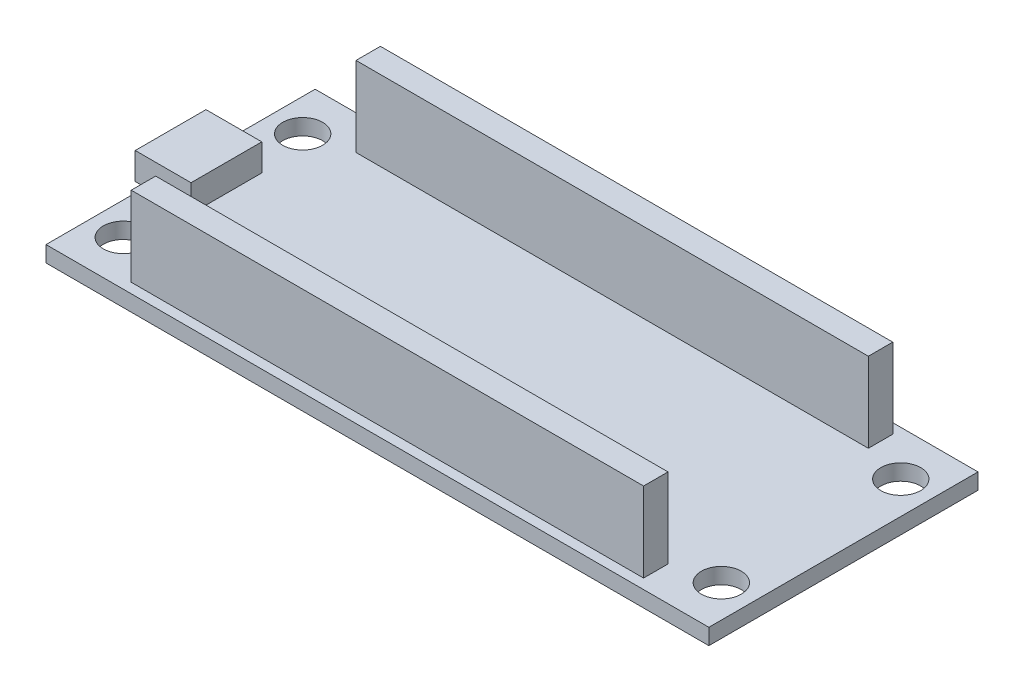
ISO-10303-21;
HEADER;
FILE_DESCRIPTION(('STEP AP214'),'2;1');
FILE_NAME('part.step','',(''),(''),'','','');
FILE_SCHEMA(('AUTOMOTIVE_DESIGN { 1 0 10303 214 1 1 1 1 }'));
ENDSEC;
DATA;
#1=APPLICATION_CONTEXT('core data for automotive mechanical design processes');
#2=APPLICATION_PROTOCOL_DEFINITION('international standard','automotive_design',2000,#1);
#3=PRODUCT_CONTEXT('',#1,'mechanical');
#4=PRODUCT('Part','Part','',(#3));
#5=PRODUCT_RELATED_PRODUCT_CATEGORY('part','',(#4));
#6=PRODUCT_DEFINITION_FORMATION('','',#4);
#7=PRODUCT_DEFINITION_CONTEXT('part definition',#1,'design');
#8=PRODUCT_DEFINITION('design','',#6,#7);
#9=PRODUCT_DEFINITION_SHAPE('','',#8);
#10=(LENGTH_UNIT() NAMED_UNIT(*) SI_UNIT(.MILLI.,.METRE.));
#11=(NAMED_UNIT(*) PLANE_ANGLE_UNIT() SI_UNIT($,.RADIAN.));
#12=(NAMED_UNIT(*) SI_UNIT($,.STERADIAN.) SOLID_ANGLE_UNIT());
#13=UNCERTAINTY_MEASURE_WITH_UNIT(LENGTH_MEASURE(1.E-05),#10,'distance_accuracy_value','');
#14=(GEOMETRIC_REPRESENTATION_CONTEXT(3) GLOBAL_UNCERTAINTY_ASSIGNED_CONTEXT((#13)) GLOBAL_UNIT_ASSIGNED_CONTEXT((#10,
#11,#12)) REPRESENTATION_CONTEXT('',''));
#15=CARTESIAN_POINT('',(0.,0.,0.));
#16=DIRECTION('',(0.,0.,1.));
#17=DIRECTION('',(1.,0.,0.));
#18=AXIS2_PLACEMENT_3D('',#15,#16,#17);
#19=CARTESIAN_POINT('',(0.,1.6,0.));
#20=DIRECTION('',(0.,1.,0.));
#21=DIRECTION('',(0.,0.,1.));
#22=AXIS2_PLACEMENT_3D('',#19,#20,#21);
#23=PLANE('',#22);
#24=DIRECTION('',(-1.,0.,0.));
#25=VECTOR('',#24,1.);
#26=CARTESIAN_POINT('',(-34.25,1.6,-3.55));
#27=LINE('',#26,#25);
#28=CARTESIAN_POINT('',(-28.65,1.6,-3.55));
#29=VERTEX_POINT('',#28);
#30=CARTESIAN_POINT('',(-33.25,1.6,-3.55));
#31=VERTEX_POINT('',#30);
#32=EDGE_CURVE('E226',#29,#31,#27,.T.);
#33=ORIENTED_EDGE('',*,*,#32,.F.);
#34=DIRECTION('',(0.,0.,-1.));
#35=VECTOR('',#34,1.);
#36=CARTESIAN_POINT('',(-28.65,1.6,-3.55));
#37=LINE('',#36,#35);
#38=CARTESIAN_POINT('',(-28.65,1.6,3.55));
#39=VERTEX_POINT('',#38);
#40=EDGE_CURVE('E236',#39,#29,#37,.T.);
#41=ORIENTED_EDGE('',*,*,#40,.F.);
#42=DIRECTION('',(1.,0.,0.));
#43=VECTOR('',#42,1.);
#44=CARTESIAN_POINT('',(-34.25,1.6,3.55));
#45=LINE('',#44,#43);
#46=CARTESIAN_POINT('',(-33.25,1.6,3.55));
#47=VERTEX_POINT('',#46);
#48=EDGE_CURVE('E11',#47,#39,#45,.T.);
#49=ORIENTED_EDGE('',*,*,#48,.F.);
#50=DIRECTION('',(0.,0.,1.));
#51=VECTOR('',#50,1.);
#52=CARTESIAN_POINT('',(-33.25,1.6,-13.5));
#53=LINE('',#52,#51);
#54=CARTESIAN_POINT('',(-33.25,1.6,13.5));
#55=VERTEX_POINT('',#54);
#56=EDGE_CURVE('E284',#47,#55,#53,.T.);
#57=ORIENTED_EDGE('',*,*,#56,.T.);
#58=DIRECTION('',(1.,0.,0.));
#59=VECTOR('',#58,1.);
#60=CARTESIAN_POINT('',(-33.25,1.6,13.5));
#61=LINE('',#60,#59);
#62=CARTESIAN_POINT('',(33.25,1.6,13.5));
#63=VERTEX_POINT('',#62);
#64=EDGE_CURVE('E288',#55,#63,#61,.T.);
#65=ORIENTED_EDGE('',*,*,#64,.T.);
#66=DIRECTION('',(0.,0.,-1.));
#67=VECTOR('',#66,1.);
#68=CARTESIAN_POINT('',(33.25,1.6,-13.5));
#69=LINE('',#68,#67);
#70=CARTESIAN_POINT('',(33.25,1.6,-13.5));
#71=VERTEX_POINT('',#70);
#72=EDGE_CURVE('E278',#63,#71,#69,.T.);
#73=ORIENTED_EDGE('',*,*,#72,.T.);
#74=DIRECTION('',(-1.,0.,0.));
#75=VECTOR('',#74,1.);
#76=CARTESIAN_POINT('',(-33.25,1.6,-13.5));
#77=LINE('',#76,#75);
#78=CARTESIAN_POINT('',(-33.25,1.6,-13.5));
#79=VERTEX_POINT('',#78);
#80=EDGE_CURVE('E281',#71,#79,#77,.T.);
#81=ORIENTED_EDGE('',*,*,#80,.T.);
#82=EDGE_CURVE('E285',#79,#31,#53,.T.);
#83=ORIENTED_EDGE('',*,*,#82,.T.);
#84=EDGE_LOOP('',(#33,#41,#49,#57,#65,#73,#81,#83));
#85=FACE_BOUND('',#84,.T.);
#86=CARTESIAN_POINT('',(30.,1.6,9.));
#87=DIRECTION('',(0.,1.,0.));
#88=DIRECTION('',(0.,0.,1.));
#89=AXIS2_PLACEMENT_3D('',#86,#87,#88);
#90=CIRCLE('',#89,2.);
#91=CARTESIAN_POINT('',(30.,1.6,11.));
#92=VERTEX_POINT('',#91);
#93=EDGE_CURVE('E260',#92,#92,#90,.T.);
#94=ORIENTED_EDGE('',*,*,#93,.F.);
#95=EDGE_LOOP('',(#94));
#96=FACE_BOUND('',#95,.T.);
#97=CARTESIAN_POINT('',(-30.,1.6,-9.));
#98=DIRECTION('',(0.,1.,0.));
#99=DIRECTION('',(0.,0.,1.));
#100=AXIS2_PLACEMENT_3D('',#97,#98,#99);
#101=CIRCLE('',#100,2.);
#102=CARTESIAN_POINT('',(-30.,1.6,-7.));
#103=VERTEX_POINT('',#102);
#104=EDGE_CURVE('E272',#103,#103,#101,.T.);
#105=ORIENTED_EDGE('',*,*,#104,.F.);
#106=EDGE_LOOP('',(#105));
#107=FACE_BOUND('',#106,.T.);
#108=CARTESIAN_POINT('',(-30.,1.6,9.));
#109=DIRECTION('',(0.,1.,0.));
#110=DIRECTION('',(0.,0.,1.));
#111=AXIS2_PLACEMENT_3D('',#108,#109,#110);
#112=CIRCLE('',#111,2.);
#113=CARTESIAN_POINT('',(-30.,1.6,11.));
#114=VERTEX_POINT('',#113);
#115=EDGE_CURVE('E266',#114,#114,#112,.T.);
#116=ORIENTED_EDGE('',*,*,#115,.F.);
#117=EDGE_LOOP('',(#116));
#118=FACE_BOUND('',#117,.T.);
#119=CARTESIAN_POINT('',(30.,1.6,-9.));
#120=DIRECTION('',(0.,1.,0.));
#121=DIRECTION('',(0.,0.,1.));
#122=AXIS2_PLACEMENT_3D('',#119,#120,#121);
#123=CIRCLE('',#122,2.);
#124=CARTESIAN_POINT('',(30.,1.6,-7.));
#125=VERTEX_POINT('',#124);
#126=EDGE_CURVE('E254',#125,#125,#123,.T.);
#127=ORIENTED_EDGE('',*,*,#126,.F.);
#128=EDGE_LOOP('',(#127));
#129=FACE_BOUND('',#128,.T.);
#130=DIRECTION('',(1.,0.,0.));
#131=VECTOR('',#130,1.);
#132=CARTESIAN_POINT('',(-25.7,1.6,-10.05));
#133=LINE('',#132,#131);
#134=CARTESIAN_POINT('',(-25.7,1.6,-10.05));
#135=VERTEX_POINT('',#134);
#136=CARTESIAN_POINT('',(25.7,1.6,-10.05));
#137=VERTEX_POINT('',#136);
#138=EDGE_CURVE('E187',#135,#137,#133,.T.);
#139=ORIENTED_EDGE('',*,*,#138,.F.);
#140=DIRECTION('',(0.,0.,1.));
#141=VECTOR('',#140,1.);
#142=CARTESIAN_POINT('',(-25.7,1.6,-12.5));
#143=LINE('',#142,#141);
#144=CARTESIAN_POINT('',(-25.7,1.6,-12.5));
#145=VERTEX_POINT('',#144);
#146=EDGE_CURVE('E184',#145,#135,#143,.T.);
#147=ORIENTED_EDGE('',*,*,#146,.F.);
#148=DIRECTION('',(-1.,0.,0.));
#149=VECTOR('',#148,1.);
#150=CARTESIAN_POINT('',(-25.7,1.6,-12.5));
#151=LINE('',#150,#149);
#152=CARTESIAN_POINT('',(25.7,1.6,-12.5));
#153=VERTEX_POINT('',#152);
#154=EDGE_CURVE('E202',#153,#145,#151,.T.);
#155=ORIENTED_EDGE('',*,*,#154,.F.);
#156=DIRECTION('',(0.,0.,-1.));
#157=VECTOR('',#156,1.);
#158=CARTESIAN_POINT('',(25.7,1.6,-12.5));
#159=LINE('',#158,#157);
#160=EDGE_CURVE('E210',#137,#153,#159,.T.);
#161=ORIENTED_EDGE('',*,*,#160,.F.);
#162=EDGE_LOOP('',(#139,#147,#155,#161));
#163=FACE_BOUND('',#162,.T.);
#164=DIRECTION('',(1.,0.,0.));
#165=VECTOR('',#164,1.);
#166=CARTESIAN_POINT('',(-25.7,1.6,12.5));
#167=LINE('',#166,#165);
#168=CARTESIAN_POINT('',(-25.7,1.6,12.5));
#169=VERTEX_POINT('',#168);
#170=CARTESIAN_POINT('',(25.7,1.6,12.5));
#171=VERTEX_POINT('',#170);
#172=EDGE_CURVE('E183',#169,#171,#167,.T.);
#173=ORIENTED_EDGE('',*,*,#172,.F.);
#174=DIRECTION('',(0.,0.,1.));
#175=VECTOR('',#174,1.);
#176=CARTESIAN_POINT('',(-25.7,1.6,12.5));
#177=LINE('',#176,#175);
#178=CARTESIAN_POINT('',(-25.7,1.6,10.05));
#179=VERTEX_POINT('',#178);
#180=EDGE_CURVE('E178',#179,#169,#177,.T.);
#181=ORIENTED_EDGE('',*,*,#180,.F.);
#182=DIRECTION('',(-1.,0.,0.));
#183=VECTOR('',#182,1.);
#184=CARTESIAN_POINT('',(-25.7,1.6,10.05));
#185=LINE('',#184,#183);
#186=CARTESIAN_POINT('',(25.7,1.6,10.05));
#187=VERTEX_POINT('',#186);
#188=EDGE_CURVE('E163',#187,#179,#185,.T.);
#189=ORIENTED_EDGE('',*,*,#188,.F.);
#190=DIRECTION('',(0.,0.,-1.));
#191=VECTOR('',#190,1.);
#192=CARTESIAN_POINT('',(25.7,1.6,12.5));
#193=LINE('',#192,#191);
#194=EDGE_CURVE('E171',#171,#187,#193,.T.);
#195=ORIENTED_EDGE('',*,*,#194,.F.);
#196=EDGE_LOOP('',(#173,#181,#189,#195));
#197=FACE_BOUND('',#196,.T.);
#198=ADVANCED_FACE('F41',(#85,#96,#107,#118,#129,#163,#197),#23,.T.);
#199=CARTESIAN_POINT('',(0.,0.,0.));
#200=DIRECTION('',(0.,1.,0.));
#201=DIRECTION('',(0.,0.,1.));
#202=AXIS2_PLACEMENT_3D('',#199,#200,#201);
#203=PLANE('',#202);
#204=DIRECTION('',(0.,0.,-1.));
#205=VECTOR('',#204,1.);
#206=CARTESIAN_POINT('',(33.25,0.,-13.5));
#207=LINE('',#206,#205);
#208=CARTESIAN_POINT('',(33.25,0.,13.5));
#209=VERTEX_POINT('',#208);
#210=CARTESIAN_POINT('',(33.25,0.,-13.5));
#211=VERTEX_POINT('',#210);
#212=EDGE_CURVE('E275',#209,#211,#207,.T.);
#213=ORIENTED_EDGE('',*,*,#212,.F.);
#214=DIRECTION('',(1.,0.,0.));
#215=VECTOR('',#214,1.);
#216=CARTESIAN_POINT('',(-33.25,0.,13.5));
#217=LINE('',#216,#215);
#218=CARTESIAN_POINT('',(-33.25,0.,13.5));
#219=VERTEX_POINT('',#218);
#220=EDGE_CURVE('E282',#219,#209,#217,.T.);
#221=ORIENTED_EDGE('',*,*,#220,.F.);
#222=DIRECTION('',(0.,0.,1.));
#223=VECTOR('',#222,1.);
#224=CARTESIAN_POINT('',(-33.25,0.,-13.5));
#225=LINE('',#224,#223);
#226=CARTESIAN_POINT('',(-33.25,0.,-13.5));
#227=VERTEX_POINT('',#226);
#228=EDGE_CURVE('E296',#227,#219,#225,.T.);
#229=ORIENTED_EDGE('',*,*,#228,.F.);
#230=DIRECTION('',(-1.,0.,0.));
#231=VECTOR('',#230,1.);
#232=CARTESIAN_POINT('',(-33.25,0.,-13.5));
#233=LINE('',#232,#231);
#234=EDGE_CURVE('E294',#211,#227,#233,.T.);
#235=ORIENTED_EDGE('',*,*,#234,.F.);
#236=EDGE_LOOP('',(#213,#221,#229,#235));
#237=FACE_BOUND('',#236,.T.);
#238=CARTESIAN_POINT('',(-30.,0.,-9.));
#239=DIRECTION('',(0.,1.,0.));
#240=DIRECTION('',(0.,0.,1.));
#241=AXIS2_PLACEMENT_3D('',#238,#239,#240);
#242=CIRCLE('',#241,2.);
#243=CARTESIAN_POINT('',(-30.,0.,-7.));
#244=VERTEX_POINT('',#243);
#245=EDGE_CURVE('E269',#244,#244,#242,.T.);
#246=ORIENTED_EDGE('',*,*,#245,.T.);
#247=EDGE_LOOP('',(#246));
#248=FACE_BOUND('',#247,.T.);
#249=CARTESIAN_POINT('',(-30.,0.,9.));
#250=DIRECTION('',(0.,1.,0.));
#251=DIRECTION('',(0.,0.,1.));
#252=AXIS2_PLACEMENT_3D('',#249,#250,#251);
#253=CIRCLE('',#252,2.);
#254=CARTESIAN_POINT('',(-30.,0.,11.));
#255=VERTEX_POINT('',#254);
#256=EDGE_CURVE('E263',#255,#255,#253,.T.);
#257=ORIENTED_EDGE('',*,*,#256,.T.);
#258=EDGE_LOOP('',(#257));
#259=FACE_BOUND('',#258,.T.);
#260=CARTESIAN_POINT('',(30.,0.,9.));
#261=DIRECTION('',(0.,1.,0.));
#262=DIRECTION('',(0.,0.,1.));
#263=AXIS2_PLACEMENT_3D('',#260,#261,#262);
#264=CIRCLE('',#263,2.);
#265=CARTESIAN_POINT('',(30.,0.,11.));
#266=VERTEX_POINT('',#265);
#267=EDGE_CURVE('E257',#266,#266,#264,.T.);
#268=ORIENTED_EDGE('',*,*,#267,.T.);
#269=EDGE_LOOP('',(#268));
#270=FACE_BOUND('',#269,.T.);
#271=CARTESIAN_POINT('',(30.,0.,-9.));
#272=DIRECTION('',(0.,1.,0.));
#273=DIRECTION('',(0.,0.,1.));
#274=AXIS2_PLACEMENT_3D('',#271,#272,#273);
#275=CIRCLE('',#274,2.);
#276=CARTESIAN_POINT('',(30.,0.,-7.));
#277=VERTEX_POINT('',#276);
#278=EDGE_CURVE('E253',#277,#277,#275,.T.);
#279=ORIENTED_EDGE('',*,*,#278,.T.);
#280=EDGE_LOOP('',(#279));
#281=FACE_BOUND('',#280,.T.);
#282=ADVANCED_FACE('F319',(#237,#248,#259,#270,#281),#203,.F.);
#283=CARTESIAN_POINT('',(33.25,1.6,-13.5));
#284=DIRECTION('',(-1.,0.,0.));
#285=DIRECTION('',(0.,0.,1.));
#286=AXIS2_PLACEMENT_3D('',#283,#284,#285);
#287=PLANE('',#286);
#288=ORIENTED_EDGE('',*,*,#212,.T.);
#289=DIRECTION('',(0.,-1.,0.));
#290=VECTOR('',#289,1.);
#291=CARTESIAN_POINT('',(33.25,1.6,-13.5));
#292=LINE('',#291,#290);
#293=EDGE_CURVE('E45',#71,#211,#292,.T.);
#294=ORIENTED_EDGE('',*,*,#293,.F.);
#295=ORIENTED_EDGE('',*,*,#72,.F.);
#296=DIRECTION('',(0.,-1.,0.));
#297=VECTOR('',#296,1.);
#298=CARTESIAN_POINT('',(33.25,1.6,13.5));
#299=LINE('',#298,#297);
#300=EDGE_CURVE('E291',#63,#209,#299,.T.);
#301=ORIENTED_EDGE('',*,*,#300,.T.);
#302=EDGE_LOOP('',(#288,#294,#295,#301));
#303=FACE_BOUND('',#302,.T.);
#304=ADVANCED_FACE('F43',(#303),#287,.F.);
#305=CARTESIAN_POINT('',(-33.25,1.6,-13.5));
#306=DIRECTION('',(0.,0.,1.));
#307=DIRECTION('',(1.,0.,0.));
#308=AXIS2_PLACEMENT_3D('',#305,#306,#307);
#309=PLANE('',#308);
#310=ORIENTED_EDGE('',*,*,#234,.T.);
#311=DIRECTION('',(0.,-1.,0.));
#312=VECTOR('',#311,1.);
#313=CARTESIAN_POINT('',(-33.25,1.6,-13.5));
#314=LINE('',#313,#312);
#315=EDGE_CURVE('E303',#79,#227,#314,.T.);
#316=ORIENTED_EDGE('',*,*,#315,.F.);
#317=ORIENTED_EDGE('',*,*,#80,.F.);
#318=ORIENTED_EDGE('',*,*,#293,.T.);
#319=EDGE_LOOP('',(#310,#316,#317,#318));
#320=FACE_BOUND('',#319,.T.);
#321=ADVANCED_FACE('F312',(#320),#309,.F.);
#322=CARTESIAN_POINT('',(-33.25,1.6,-13.5));
#323=DIRECTION('',(1.,0.,0.));
#324=DIRECTION('',(0.,0.,-1.));
#325=AXIS2_PLACEMENT_3D('',#322,#323,#324);
#326=PLANE('',#325);
#327=ORIENTED_EDGE('',*,*,#228,.T.);
#328=DIRECTION('',(0.,-1.,0.));
#329=VECTOR('',#328,1.);
#330=CARTESIAN_POINT('',(-33.25,1.6,13.5));
#331=LINE('',#330,#329);
#332=EDGE_CURVE('E301',#55,#219,#331,.T.);
#333=ORIENTED_EDGE('',*,*,#332,.F.);
#334=ORIENTED_EDGE('',*,*,#56,.F.);
#335=EDGE_CURVE('E289',#31,#47,#53,.T.);
#336=ORIENTED_EDGE('',*,*,#335,.F.);
#337=ORIENTED_EDGE('',*,*,#82,.F.);
#338=ORIENTED_EDGE('',*,*,#315,.T.);
#339=EDGE_LOOP('',(#327,#333,#334,#336,#337,#338));
#340=FACE_BOUND('',#339,.T.);
#341=ADVANCED_FACE('F322',(#340),#326,.F.);
#342=CARTESIAN_POINT('',(-33.25,1.6,13.5));
#343=DIRECTION('',(0.,0.,-1.));
#344=DIRECTION('',(-1.,0.,0.));
#345=AXIS2_PLACEMENT_3D('',#342,#343,#344);
#346=PLANE('',#345);
#347=ORIENTED_EDGE('',*,*,#220,.T.);
#348=ORIENTED_EDGE('',*,*,#300,.F.);
#349=ORIENTED_EDGE('',*,*,#64,.F.);
#350=ORIENTED_EDGE('',*,*,#332,.T.);
#351=EDGE_LOOP('',(#347,#348,#349,#350));
#352=FACE_BOUND('',#351,.T.);
#353=ADVANCED_FACE('F326',(#352),#346,.F.);
#354=CARTESIAN_POINT('',(-30.,1.6,-9.));
#355=DIRECTION('',(0.,-1.,0.));
#356=DIRECTION('',(0.,0.,-1.));
#357=AXIS2_PLACEMENT_3D('',#354,#355,#356);
#358=CYLINDRICAL_SURFACE('',#357,2.);
#359=ORIENTED_EDGE('',*,*,#104,.T.);
#360=EDGE_LOOP('',(#359));
#361=FACE_BOUND('',#360,.T.);
#362=ORIENTED_EDGE('',*,*,#245,.F.);
#363=EDGE_LOOP('',(#362));
#364=FACE_BOUND('',#363,.T.);
#365=ADVANCED_FACE('F370',(#361,#364),#358,.F.);
#366=CARTESIAN_POINT('',(-30.,1.6,9.));
#367=DIRECTION('',(0.,-1.,0.));
#368=DIRECTION('',(0.,0.,-1.));
#369=AXIS2_PLACEMENT_3D('',#366,#367,#368);
#370=CYLINDRICAL_SURFACE('',#369,2.);
#371=ORIENTED_EDGE('',*,*,#115,.T.);
#372=EDGE_LOOP('',(#371));
#373=FACE_BOUND('',#372,.T.);
#374=ORIENTED_EDGE('',*,*,#256,.F.);
#375=EDGE_LOOP('',(#374));
#376=FACE_BOUND('',#375,.T.);
#377=ADVANCED_FACE('F411',(#373,#376),#370,.F.);
#378=CARTESIAN_POINT('',(30.,1.6,9.));
#379=DIRECTION('',(0.,-1.,0.));
#380=DIRECTION('',(0.,0.,-1.));
#381=AXIS2_PLACEMENT_3D('',#378,#379,#380);
#382=CYLINDRICAL_SURFACE('',#381,2.);
#383=ORIENTED_EDGE('',*,*,#93,.T.);
#384=EDGE_LOOP('',(#383));
#385=FACE_BOUND('',#384,.T.);
#386=ORIENTED_EDGE('',*,*,#267,.F.);
#387=EDGE_LOOP('',(#386));
#388=FACE_BOUND('',#387,.T.);
#389=ADVANCED_FACE('F419',(#385,#388),#382,.F.);
#390=CARTESIAN_POINT('',(30.,1.6,-9.));
#391=DIRECTION('',(0.,-1.,0.));
#392=DIRECTION('',(0.,0.,-1.));
#393=AXIS2_PLACEMENT_3D('',#390,#391,#392);
#394=CYLINDRICAL_SURFACE('',#393,2.);
#395=ORIENTED_EDGE('',*,*,#126,.T.);
#396=EDGE_LOOP('',(#395));
#397=FACE_BOUND('',#396,.T.);
#398=ORIENTED_EDGE('',*,*,#278,.F.);
#399=EDGE_LOOP('',(#398));
#400=FACE_BOUND('',#399,.T.);
#401=ADVANCED_FACE('F427',(#397,#400),#394,.F.);
#402=CARTESIAN_POINT('',(0.,1.6,0.));
#403=DIRECTION('',(0.,1.,0.));
#404=DIRECTION('',(0.,0.,1.));
#405=AXIS2_PLACEMENT_3D('',#402,#403,#404);
#406=PLANE('',#405);
#407=CARTESIAN_POINT('',(-34.25,1.6,-3.55));
#408=VERTEX_POINT('',#407);
#409=EDGE_CURVE('E239',#31,#408,#27,.T.);
#410=ORIENTED_EDGE('',*,*,#409,.F.);
#411=ORIENTED_EDGE('',*,*,#335,.T.);
#412=CARTESIAN_POINT('',(-34.25,1.6,3.55));
#413=VERTEX_POINT('',#412);
#414=EDGE_CURVE('E51',#413,#47,#45,.T.);
#415=ORIENTED_EDGE('',*,*,#414,.F.);
#416=DIRECTION('',(0.,0.,1.));
#417=VECTOR('',#416,1.);
#418=CARTESIAN_POINT('',(-34.25,1.6,-3.55));
#419=LINE('',#418,#417);
#420=EDGE_CURVE('E221',#408,#413,#419,.T.);
#421=ORIENTED_EDGE('',*,*,#420,.F.);
#422=EDGE_LOOP('',(#410,#411,#415,#421));
#423=FACE_BOUND('',#422,.T.);
#424=ADVANCED_FACE('F332',(#423),#406,.F.);
#425=CARTESIAN_POINT('',(-34.25,4.3,-3.55));
#426=DIRECTION('',(1.,0.,0.));
#427=DIRECTION('',(0.,0.,-1.));
#428=AXIS2_PLACEMENT_3D('',#425,#426,#427);
#429=PLANE('',#428);
#430=ORIENTED_EDGE('',*,*,#420,.T.);
#431=DIRECTION('',(0.,-1.,0.));
#432=VECTOR('',#431,1.);
#433=CARTESIAN_POINT('',(-34.25,4.3,3.55));
#434=LINE('',#433,#432);
#435=CARTESIAN_POINT('',(-34.25,4.3,3.55));
#436=VERTEX_POINT('',#435);
#437=EDGE_CURVE('E250',#436,#413,#434,.T.);
#438=ORIENTED_EDGE('',*,*,#437,.F.);
#439=DIRECTION('',(0.,0.,1.));
#440=VECTOR('',#439,1.);
#441=CARTESIAN_POINT('',(-34.25,4.3,-3.55));
#442=LINE('',#441,#440);
#443=CARTESIAN_POINT('',(-34.25,4.3,-3.55));
#444=VERTEX_POINT('',#443);
#445=EDGE_CURVE('E222',#444,#436,#442,.T.);
#446=ORIENTED_EDGE('',*,*,#445,.F.);
#447=DIRECTION('',(0.,-1.,0.));
#448=VECTOR('',#447,1.);
#449=CARTESIAN_POINT('',(-34.25,4.3,-3.55));
#450=LINE('',#449,#448);
#451=EDGE_CURVE('E232',#444,#408,#450,.T.);
#452=ORIENTED_EDGE('',*,*,#451,.T.);
#453=EDGE_LOOP('',(#430,#438,#446,#452));
#454=FACE_BOUND('',#453,.T.);
#455=ADVANCED_FACE('F340',(#454),#429,.F.);
#456=CARTESIAN_POINT('',(-34.25,4.3,3.55));
#457=DIRECTION('',(0.,0.,-1.));
#458=DIRECTION('',(-1.,0.,0.));
#459=AXIS2_PLACEMENT_3D('',#456,#457,#458);
#460=PLANE('',#459);
#461=ORIENTED_EDGE('',*,*,#414,.T.);
#462=ORIENTED_EDGE('',*,*,#48,.T.);
#463=DIRECTION('',(0.,-1.,0.));
#464=VECTOR('',#463,1.);
#465=CARTESIAN_POINT('',(-28.65,4.3,3.55));
#466=LINE('',#465,#464);
#467=CARTESIAN_POINT('',(-28.65,4.3,3.55));
#468=VERTEX_POINT('',#467);
#469=EDGE_CURVE('E247',#468,#39,#466,.T.);
#470=ORIENTED_EDGE('',*,*,#469,.F.);
#471=DIRECTION('',(1.,0.,0.));
#472=VECTOR('',#471,1.);
#473=CARTESIAN_POINT('',(-34.25,4.3,3.55));
#474=LINE('',#473,#472);
#475=EDGE_CURVE('E225',#436,#468,#474,.T.);
#476=ORIENTED_EDGE('',*,*,#475,.F.);
#477=ORIENTED_EDGE('',*,*,#437,.T.);
#478=EDGE_LOOP('',(#461,#462,#470,#476,#477));
#479=FACE_BOUND('',#478,.T.);
#480=ADVANCED_FACE('F335',(#479),#460,.F.);
#481=CARTESIAN_POINT('',(-28.65,4.3,-3.55));
#482=DIRECTION('',(-1.,0.,0.));
#483=DIRECTION('',(0.,0.,1.));
#484=AXIS2_PLACEMENT_3D('',#481,#482,#483);
#485=PLANE('',#484);
#486=ORIENTED_EDGE('',*,*,#40,.T.);
#487=DIRECTION('',(0.,-1.,0.));
#488=VECTOR('',#487,1.);
#489=CARTESIAN_POINT('',(-28.65,4.3,-3.55));
#490=LINE('',#489,#488);
#491=CARTESIAN_POINT('',(-28.65,4.3,-3.55));
#492=VERTEX_POINT('',#491);
#493=EDGE_CURVE('E244',#492,#29,#490,.T.);
#494=ORIENTED_EDGE('',*,*,#493,.F.);
#495=DIRECTION('',(0.,0.,-1.));
#496=VECTOR('',#495,1.);
#497=CARTESIAN_POINT('',(-28.65,4.3,-3.55));
#498=LINE('',#497,#496);
#499=EDGE_CURVE('E228',#468,#492,#498,.T.);
#500=ORIENTED_EDGE('',*,*,#499,.F.);
#501=ORIENTED_EDGE('',*,*,#469,.T.);
#502=EDGE_LOOP('',(#486,#494,#500,#501));
#503=FACE_BOUND('',#502,.T.);
#504=ADVANCED_FACE('F347',(#503),#485,.F.);
#505=CARTESIAN_POINT('',(-34.25,4.3,-3.55));
#506=DIRECTION('',(0.,0.,1.));
#507=DIRECTION('',(1.,0.,0.));
#508=AXIS2_PLACEMENT_3D('',#505,#506,#507);
#509=PLANE('',#508);
#510=ORIENTED_EDGE('',*,*,#32,.T.);
#511=ORIENTED_EDGE('',*,*,#409,.T.);
#512=ORIENTED_EDGE('',*,*,#451,.F.);
#513=DIRECTION('',(-1.,0.,0.));
#514=VECTOR('',#513,1.);
#515=CARTESIAN_POINT('',(-34.25,4.3,-3.55));
#516=LINE('',#515,#514);
#517=EDGE_CURVE('E230',#492,#444,#516,.T.);
#518=ORIENTED_EDGE('',*,*,#517,.F.);
#519=ORIENTED_EDGE('',*,*,#493,.T.);
#520=EDGE_LOOP('',(#510,#511,#512,#518,#519));
#521=FACE_BOUND('',#520,.T.);
#522=ADVANCED_FACE('F344',(#521),#509,.F.);
#523=CARTESIAN_POINT('',(0.,4.3,0.));
#524=DIRECTION('',(0.,1.,0.));
#525=DIRECTION('',(0.,0.,1.));
#526=AXIS2_PLACEMENT_3D('',#523,#524,#525);
#527=PLANE('',#526);
#528=ORIENTED_EDGE('',*,*,#445,.T.);
#529=ORIENTED_EDGE('',*,*,#475,.T.);
#530=ORIENTED_EDGE('',*,*,#499,.T.);
#531=ORIENTED_EDGE('',*,*,#517,.T.);
#532=EDGE_LOOP('',(#528,#529,#530,#531));
#533=FACE_BOUND('',#532,.T.);
#534=ADVANCED_FACE('F350',(#533),#527,.T.);
#535=CARTESIAN_POINT('',(-25.7,9.6,-12.5));
#536=DIRECTION('',(1.,0.,0.));
#537=DIRECTION('',(0.,0.,-1.));
#538=AXIS2_PLACEMENT_3D('',#535,#536,#537);
#539=PLANE('',#538);
#540=ORIENTED_EDGE('',*,*,#146,.T.);
#541=DIRECTION('',(0.,-1.,0.));
#542=VECTOR('',#541,1.);
#543=CARTESIAN_POINT('',(-25.7,9.6,-10.05));
#544=LINE('',#543,#542);
#545=CARTESIAN_POINT('',(-25.7,9.6,-10.05));
#546=VERTEX_POINT('',#545);
#547=EDGE_CURVE('E219',#546,#135,#544,.T.);
#548=ORIENTED_EDGE('',*,*,#547,.F.);
#549=DIRECTION('',(0.,0.,1.));
#550=VECTOR('',#549,1.);
#551=CARTESIAN_POINT('',(-25.7,9.6,-12.5));
#552=LINE('',#551,#550);
#553=CARTESIAN_POINT('',(-25.7,9.6,-12.5));
#554=VERTEX_POINT('',#553);
#555=EDGE_CURVE('E198',#554,#546,#552,.T.);
#556=ORIENTED_EDGE('',*,*,#555,.F.);
#557=DIRECTION('',(0.,-1.,0.));
#558=VECTOR('',#557,1.);
#559=CARTESIAN_POINT('',(-25.7,9.6,-12.5));
#560=LINE('',#559,#558);
#561=EDGE_CURVE('E207',#554,#145,#560,.T.);
#562=ORIENTED_EDGE('',*,*,#561,.T.);
#563=EDGE_LOOP('',(#540,#548,#556,#562));
#564=FACE_BOUND('',#563,.T.);
#565=ADVANCED_FACE('F352',(#564),#539,.F.);
#566=CARTESIAN_POINT('',(-25.7,9.6,-10.05));
#567=DIRECTION('',(0.,0.,-1.));
#568=DIRECTION('',(-1.,0.,0.));
#569=AXIS2_PLACEMENT_3D('',#566,#567,#568);
#570=PLANE('',#569);
#571=ORIENTED_EDGE('',*,*,#138,.T.);
#572=DIRECTION('',(0.,-1.,0.));
#573=VECTOR('',#572,1.);
#574=CARTESIAN_POINT('',(25.7,9.6,-10.05));
#575=LINE('',#574,#573);
#576=CARTESIAN_POINT('',(25.7,9.6,-10.05));
#577=VERTEX_POINT('',#576);
#578=EDGE_CURVE('E216',#577,#137,#575,.T.);
#579=ORIENTED_EDGE('',*,*,#578,.F.);
#580=DIRECTION('',(1.,0.,0.));
#581=VECTOR('',#580,1.);
#582=CARTESIAN_POINT('',(-25.7,9.6,-10.05));
#583=LINE('',#582,#581);
#584=EDGE_CURVE('E201',#546,#577,#583,.T.);
#585=ORIENTED_EDGE('',*,*,#584,.F.);
#586=ORIENTED_EDGE('',*,*,#547,.T.);
#587=EDGE_LOOP('',(#571,#579,#585,#586));
#588=FACE_BOUND('',#587,.T.);
#589=ADVANCED_FACE('F359',(#588),#570,.F.);
#590=CARTESIAN_POINT('',(25.7,9.6,-12.5));
#591=DIRECTION('',(-1.,0.,0.));
#592=DIRECTION('',(0.,0.,1.));
#593=AXIS2_PLACEMENT_3D('',#590,#591,#592);
#594=PLANE('',#593);
#595=ORIENTED_EDGE('',*,*,#160,.T.);
#596=DIRECTION('',(0.,-1.,0.));
#597=VECTOR('',#596,1.);
#598=CARTESIAN_POINT('',(25.7,9.6,-12.5));
#599=LINE('',#598,#597);
#600=CARTESIAN_POINT('',(25.7,9.6,-12.5));
#601=VERTEX_POINT('',#600);
#602=EDGE_CURVE('E66',#601,#153,#599,.T.);
#603=ORIENTED_EDGE('',*,*,#602,.F.);
#604=DIRECTION('',(0.,0.,-1.));
#605=VECTOR('',#604,1.);
#606=CARTESIAN_POINT('',(25.7,9.6,-12.5));
#607=LINE('',#606,#605);
#608=EDGE_CURVE('E204',#577,#601,#607,.T.);
#609=ORIENTED_EDGE('',*,*,#608,.F.);
#610=ORIENTED_EDGE('',*,*,#578,.T.);
#611=EDGE_LOOP('',(#595,#603,#609,#610));
#612=FACE_BOUND('',#611,.T.);
#613=ADVANCED_FACE('F489',(#612),#594,.F.);
#614=CARTESIAN_POINT('',(-25.7,9.6,-12.5));
#615=DIRECTION('',(0.,0.,1.));
#616=DIRECTION('',(1.,0.,0.));
#617=AXIS2_PLACEMENT_3D('',#614,#615,#616);
#618=PLANE('',#617);
#619=ORIENTED_EDGE('',*,*,#154,.T.);
#620=ORIENTED_EDGE('',*,*,#561,.F.);
#621=DIRECTION('',(-1.,0.,0.));
#622=VECTOR('',#621,1.);
#623=CARTESIAN_POINT('',(-25.7,9.6,-12.5));
#624=LINE('',#623,#622);
#625=EDGE_CURVE('E206',#601,#554,#624,.T.);
#626=ORIENTED_EDGE('',*,*,#625,.F.);
#627=ORIENTED_EDGE('',*,*,#602,.T.);
#628=EDGE_LOOP('',(#619,#620,#626,#627));
#629=FACE_BOUND('',#628,.T.);
#630=ADVANCED_FACE('F498',(#629),#618,.F.);
#631=CARTESIAN_POINT('',(0.,9.6,0.));
#632=DIRECTION('',(0.,1.,0.));
#633=DIRECTION('',(0.,0.,1.));
#634=AXIS2_PLACEMENT_3D('',#631,#632,#633);
#635=PLANE('',#634);
#636=ORIENTED_EDGE('',*,*,#555,.T.);
#637=ORIENTED_EDGE('',*,*,#584,.T.);
#638=ORIENTED_EDGE('',*,*,#608,.T.);
#639=ORIENTED_EDGE('',*,*,#625,.T.);
#640=EDGE_LOOP('',(#636,#637,#638,#639));
#641=FACE_BOUND('',#640,.T.);
#642=ADVANCED_FACE('F507',(#641),#635,.T.);
#643=CARTESIAN_POINT('',(-25.7,9.6,12.5));
#644=DIRECTION('',(1.,0.,0.));
#645=DIRECTION('',(0.,0.,-1.));
#646=AXIS2_PLACEMENT_3D('',#643,#644,#645);
#647=PLANE('',#646);
#648=ORIENTED_EDGE('',*,*,#180,.T.);
#649=DIRECTION('',(0.,-1.,0.));
#650=VECTOR('',#649,1.);
#651=CARTESIAN_POINT('',(-25.7,9.6,12.5));
#652=LINE('',#651,#650);
#653=CARTESIAN_POINT('',(-25.7,9.6,12.5));
#654=VERTEX_POINT('',#653);
#655=EDGE_CURVE('E570',#654,#169,#652,.T.);
#656=ORIENTED_EDGE('',*,*,#655,.F.);
#657=DIRECTION('',(0.,0.,1.));
#658=VECTOR('',#657,1.);
#659=CARTESIAN_POINT('',(-25.7,9.6,12.5));
#660=LINE('',#659,#658);
#661=CARTESIAN_POINT('',(-25.7,9.6,10.05));
#662=VERTEX_POINT('',#661);
#663=EDGE_CURVE('E172',#662,#654,#660,.T.);
#664=ORIENTED_EDGE('',*,*,#663,.F.);
#665=DIRECTION('',(0.,-1.,0.));
#666=VECTOR('',#665,1.);
#667=CARTESIAN_POINT('',(-25.7,9.6,10.05));
#668=LINE('',#667,#666);
#669=EDGE_CURVE('E166',#662,#179,#668,.T.);
#670=ORIENTED_EDGE('',*,*,#669,.T.);
#671=EDGE_LOOP('',(#648,#656,#664,#670));
#672=FACE_BOUND('',#671,.T.);
#673=ADVANCED_FACE('F176',(#672),#647,.F.);
#674=CARTESIAN_POINT('',(-25.7,9.6,12.5));
#675=DIRECTION('',(0.,0.,-1.));
#676=DIRECTION('',(-1.,0.,0.));
#677=AXIS2_PLACEMENT_3D('',#674,#675,#676);
#678=PLANE('',#677);
#679=ORIENTED_EDGE('',*,*,#172,.T.);
#680=DIRECTION('',(0.,-1.,0.));
#681=VECTOR('',#680,1.);
#682=CARTESIAN_POINT('',(25.7,9.6,12.5));
#683=LINE('',#682,#681);
#684=CARTESIAN_POINT('',(25.7,9.6,12.5));
#685=VERTEX_POINT('',#684);
#686=EDGE_CURVE('E571',#685,#171,#683,.T.);
#687=ORIENTED_EDGE('',*,*,#686,.F.);
#688=DIRECTION('',(1.,0.,0.));
#689=VECTOR('',#688,1.);
#690=CARTESIAN_POINT('',(-25.7,9.6,12.5));
#691=LINE('',#690,#689);
#692=EDGE_CURVE('E195',#654,#685,#691,.T.);
#693=ORIENTED_EDGE('',*,*,#692,.F.);
#694=ORIENTED_EDGE('',*,*,#655,.T.);
#695=EDGE_LOOP('',(#679,#687,#693,#694));
#696=FACE_BOUND('',#695,.T.);
#697=ADVANCED_FACE('F523',(#696),#678,.F.);
#698=CARTESIAN_POINT('',(25.7,9.6,12.5));
#699=DIRECTION('',(-1.,0.,0.));
#700=DIRECTION('',(0.,0.,1.));
#701=AXIS2_PLACEMENT_3D('',#698,#699,#700);
#702=PLANE('',#701);
#703=ORIENTED_EDGE('',*,*,#194,.T.);
#704=DIRECTION('',(0.,-1.,0.));
#705=VECTOR('',#704,1.);
#706=CARTESIAN_POINT('',(25.7,9.6,10.05));
#707=LINE('',#706,#705);
#708=CARTESIAN_POINT('',(25.7,9.6,10.05));
#709=VERTEX_POINT('',#708);
#710=EDGE_CURVE('E58',#709,#187,#707,.T.);
#711=ORIENTED_EDGE('',*,*,#710,.F.);
#712=DIRECTION('',(0.,0.,-1.));
#713=VECTOR('',#712,1.);
#714=CARTESIAN_POINT('',(25.7,9.6,12.5));
#715=LINE('',#714,#713);
#716=EDGE_CURVE('E193',#685,#709,#715,.T.);
#717=ORIENTED_EDGE('',*,*,#716,.F.);
#718=ORIENTED_EDGE('',*,*,#686,.T.);
#719=EDGE_LOOP('',(#703,#711,#717,#718));
#720=FACE_BOUND('',#719,.T.);
#721=ADVANCED_FACE('F531',(#720),#702,.F.);
#722=CARTESIAN_POINT('',(-25.7,9.6,10.05));
#723=DIRECTION('',(0.,0.,1.));
#724=DIRECTION('',(1.,0.,0.));
#725=AXIS2_PLACEMENT_3D('',#722,#723,#724);
#726=PLANE('',#725);
#727=ORIENTED_EDGE('',*,*,#188,.T.);
#728=ORIENTED_EDGE('',*,*,#669,.F.);
#729=DIRECTION('',(-1.,0.,0.));
#730=VECTOR('',#729,1.);
#731=CARTESIAN_POINT('',(-25.7,9.6,10.05));
#732=LINE('',#731,#730);
#733=EDGE_CURVE('E181',#709,#662,#732,.T.);
#734=ORIENTED_EDGE('',*,*,#733,.F.);
#735=ORIENTED_EDGE('',*,*,#710,.T.);
#736=EDGE_LOOP('',(#727,#728,#734,#735));
#737=FACE_BOUND('',#736,.T.);
#738=ADVANCED_FACE('F165',(#737),#726,.F.);
#739=CARTESIAN_POINT('',(0.,9.6,0.));
#740=DIRECTION('',(0.,-1.,0.));
#741=DIRECTION('',(0.,0.,-1.));
#742=AXIS2_PLACEMENT_3D('',#739,#740,#741);
#743=PLANE('',#742);
#744=ORIENTED_EDGE('',*,*,#663,.T.);
#745=ORIENTED_EDGE('',*,*,#692,.T.);
#746=ORIENTED_EDGE('',*,*,#716,.T.);
#747=ORIENTED_EDGE('',*,*,#733,.T.);
#748=EDGE_LOOP('',(#744,#745,#746,#747));
#749=FACE_BOUND('',#748,.T.);
#750=ADVANCED_FACE('F548',(#749),#743,.F.);
#751=CLOSED_SHELL('',(#198,#282,#304,#321,#341,#353,#365,#377,#389,#401,#424,#455,#480,#504,
#522,#534,#565,#589,#613,#630,#642,#673,#697,#721,#738,#750));
#752=MANIFOLD_SOLID_BREP('B2',#751);
#753=ADVANCED_BREP_SHAPE_REPRESENTATION('',(#18,#752),#14);
#754=SHAPE_DEFINITION_REPRESENTATION(#9,#753);
ENDSEC;
END-ISO-10303-21;
